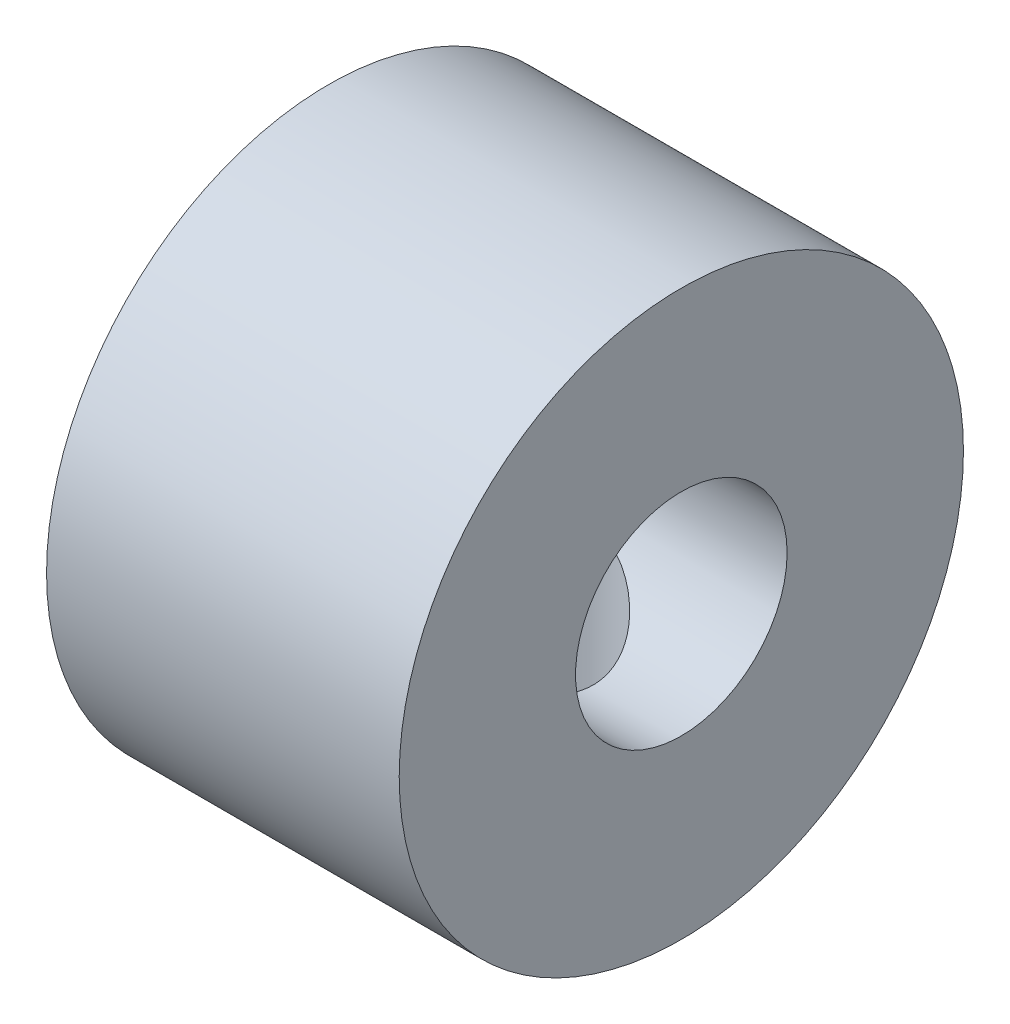
ISO-10303-21;
HEADER;
FILE_DESCRIPTION(('STEP AP214'),'2;1');
FILE_NAME('part.step','',(''),(''),'','','');
FILE_SCHEMA(('AUTOMOTIVE_DESIGN { 1 0 10303 214 1 1 1 1 }'));
ENDSEC;
DATA;
#1=APPLICATION_CONTEXT('core data for automotive mechanical design processes');
#2=APPLICATION_PROTOCOL_DEFINITION('international standard','automotive_design',2000,#1);
#3=PRODUCT_CONTEXT('',#1,'mechanical');
#4=PRODUCT('Part','Part','',(#3));
#5=PRODUCT_RELATED_PRODUCT_CATEGORY('part','',(#4));
#6=PRODUCT_DEFINITION_FORMATION('','',#4);
#7=PRODUCT_DEFINITION_CONTEXT('part definition',#1,'design');
#8=PRODUCT_DEFINITION('design','',#6,#7);
#9=PRODUCT_DEFINITION_SHAPE('','',#8);
#10=(LENGTH_UNIT() NAMED_UNIT(*) SI_UNIT(.MILLI.,.METRE.));
#11=(NAMED_UNIT(*) PLANE_ANGLE_UNIT() SI_UNIT($,.RADIAN.));
#12=(NAMED_UNIT(*) SI_UNIT($,.STERADIAN.) SOLID_ANGLE_UNIT());
#13=UNCERTAINTY_MEASURE_WITH_UNIT(LENGTH_MEASURE(1.E-05),#10,'distance_accuracy_value','');
#14=(GEOMETRIC_REPRESENTATION_CONTEXT(3) GLOBAL_UNCERTAINTY_ASSIGNED_CONTEXT((#13)) GLOBAL_UNIT_ASSIGNED_CONTEXT((#10,
#11,#12)) REPRESENTATION_CONTEXT('',''));
#15=CARTESIAN_POINT('',(0.,0.,0.));
#16=DIRECTION('',(0.,0.,1.));
#17=DIRECTION('',(1.,0.,0.));
#18=AXIS2_PLACEMENT_3D('',#15,#16,#17);
#19=CARTESIAN_POINT('',(5.,0.,0.));
#20=DIRECTION('',(1.,0.,0.));
#21=DIRECTION('',(0.,0.,-1.));
#22=AXIS2_PLACEMENT_3D('',#19,#20,#21);
#23=PLANE('',#22);
#24=CARTESIAN_POINT('',(5.,0.,0.));
#25=DIRECTION('',(1.,0.,0.));
#26=DIRECTION('',(0.,0.,-1.));
#27=AXIS2_PLACEMENT_3D('',#24,#25,#26);
#28=CIRCLE('',#27,4.);
#29=CARTESIAN_POINT('',(5.,0.,-4.));
#30=VERTEX_POINT('',#29);
#31=EDGE_CURVE('E10',#30,#30,#28,.T.);
#32=ORIENTED_EDGE('',*,*,#31,.T.);
#33=EDGE_LOOP('',(#32));
#34=FACE_BOUND('',#33,.T.);
#35=CARTESIAN_POINT('',(5.,0.,0.));
#36=DIRECTION('',(1.,0.,0.));
#37=DIRECTION('',(0.,0.,-1.));
#38=AXIS2_PLACEMENT_3D('',#35,#36,#37);
#39=CIRCLE('',#38,1.5);
#40=CARTESIAN_POINT('',(5.,0.,-1.5));
#41=VERTEX_POINT('',#40);
#42=EDGE_CURVE('E56',#41,#41,#39,.T.);
#43=ORIENTED_EDGE('',*,*,#42,.F.);
#44=EDGE_LOOP('',(#43));
#45=FACE_BOUND('',#44,.T.);
#46=ADVANCED_FACE('F37',(#34,#45),#23,.T.);
#47=CARTESIAN_POINT('',(0.,0.,0.));
#48=DIRECTION('',(1.,0.,0.));
#49=DIRECTION('',(0.,0.,-1.));
#50=AXIS2_PLACEMENT_3D('',#47,#48,#49);
#51=PLANE('',#50);
#52=CARTESIAN_POINT('',(0.,0.,0.));
#53=DIRECTION('',(1.,0.,0.));
#54=DIRECTION('',(0.,0.,-1.));
#55=AXIS2_PLACEMENT_3D('',#52,#53,#54);
#56=CIRCLE('',#55,4.);
#57=CARTESIAN_POINT('',(0.,0.,-4.));
#58=VERTEX_POINT('',#57);
#59=EDGE_CURVE('E51',#58,#58,#56,.T.);
#60=ORIENTED_EDGE('',*,*,#59,.F.);
#61=EDGE_LOOP('',(#60));
#62=FACE_BOUND('',#61,.T.);
#63=CARTESIAN_POINT('',(0.,0.,0.));
#64=DIRECTION('',(1.,0.,0.));
#65=DIRECTION('',(0.,0.,-1.));
#66=AXIS2_PLACEMENT_3D('',#63,#64,#65);
#67=CIRCLE('',#66,1.5);
#68=CARTESIAN_POINT('',(0.,0.,-1.5));
#69=VERTEX_POINT('',#68);
#70=EDGE_CURVE('E58',#69,#69,#67,.T.);
#71=ORIENTED_EDGE('',*,*,#70,.T.);
#72=EDGE_LOOP('',(#71));
#73=FACE_BOUND('',#72,.T.);
#74=ADVANCED_FACE('F79',(#62,#73),#51,.F.);
#75=CARTESIAN_POINT('',(5.,0.,0.));
#76=DIRECTION('',(-1.,0.,0.));
#77=DIRECTION('',(0.,0.,1.));
#78=AXIS2_PLACEMENT_3D('',#75,#76,#77);
#79=CYLINDRICAL_SURFACE('',#78,4.);
#80=CARTESIAN_POINT('',(1.25,-4.,0.));
#81=CARTESIAN_POINT('',(1.25000044658758,-3.99999965877989,0.0684391851745465));
#82=CARTESIAN_POINT('',(1.25563922694445,-3.99822694984841,0.136883052502859));
#83=CARTESIAN_POINT('',(1.27798624153924,-3.99132894088807,0.271769209588448));
#84=CARTESIAN_POINT('',(1.29469698136436,-3.9862028819986,0.338211042725907));
#85=CARTESIAN_POINT('',(1.33856937119574,-3.97315815697909,0.467128543650806));
#86=CARTESIAN_POINT('',(1.36571484465297,-3.96524381499025,0.529610176985804));
#87=CARTESIAN_POINT('',(1.42961731767833,-3.94743969161093,0.64913480234646));
#88=CARTESIAN_POINT('',(1.46637583178059,-3.93754959899905,0.706176935444885));
#89=CARTESIAN_POINT('',(1.54965599201736,-3.91650213740282,0.814965334952281));
#90=CARTESIAN_POINT('',(1.59642088506107,-3.90531715926989,0.86652002815666));
#91=CARTESIAN_POINT('',(1.69786839241355,-3.88310046374208,0.961197382036993));
#92=CARTESIAN_POINT('',(1.75255247749455,-3.87206877523457,1.0043184728987));
#93=CARTESIAN_POINT('',(1.86994456380808,-3.85111144698172,1.08194336483113));
#94=CARTESIAN_POINT('',(1.93281747752722,-3.84121988301796,1.11620784150129));
#95=CARTESIAN_POINT('',(2.06379231498187,-3.82407801799234,1.17359741076672));
#96=CARTESIAN_POINT('',(2.13189285579393,-3.81682702128689,1.19672543771945));
#97=CARTESIAN_POINT('',(2.26922807745206,-3.80607606984501,1.23048459930033));
#98=CARTESIAN_POINT('',(2.33836684363885,-3.80246972929508,1.24147110007865));
#99=CARTESIAN_POINT('',(2.47759311891189,-3.7991005514095,1.25174555036988));
#100=CARTESIAN_POINT('',(2.54768037082166,-3.79933669227334,1.25103660995772));
#101=CARTESIAN_POINT('',(2.68387446026898,-3.80353189075438,1.23821824732739));
#102=CARTESIAN_POINT('',(2.75002912586156,-3.80734341745949,1.22656057869383));
#103=CARTESIAN_POINT('',(2.87939215653735,-3.81802025652489,1.19290813355626));
#104=CARTESIAN_POINT('',(2.9426002077088,-3.82488589343115,1.1709122584455));
#105=CARTESIAN_POINT('',(3.06535194443263,-3.84101044014297,1.11688874681277));
#106=CARTESIAN_POINT('',(3.12482861069198,-3.85030284660824,1.08471925662082));
#107=CARTESIAN_POINT('',(3.23768776787912,-3.8702185658007,1.01136020737848));
#108=CARTESIAN_POINT('',(3.29106867025371,-3.88084222394551,0.970168305215772));
#109=CARTESIAN_POINT('',(3.39277494341699,-3.90281527800493,0.877716954182123));
#110=CARTESIAN_POINT('',(3.44075955777968,-3.91417569605696,0.826084570592817));
#111=CARTESIAN_POINT('',(3.52747189357968,-3.9359157075958,0.715364408095531));
#112=CARTESIAN_POINT('',(3.56619892921921,-3.94629522838372,0.656276077349021));
#113=CARTESIAN_POINT('',(3.63352768860127,-3.96501294890191,0.531664610465455));
#114=CARTESIAN_POINT('',(3.66204813546397,-3.97333460648208,0.46609490691928));
#115=CARTESIAN_POINT('',(3.70755300085157,-3.98687955828554,0.330767977782644));
#116=CARTESIAN_POINT('',(3.7245409222384,-3.99210379325151,0.261012030724609));
#117=CARTESIAN_POINT('',(3.74591804257898,-3.99871389395014,0.122185157290345));
#118=CARTESIAN_POINT('',(3.75076854359352,-4.00024022895439,0.0531918487888426));
#119=CARTESIAN_POINT('',(3.74903377336267,-3.99969799730981,-0.0846303057325845));
#120=CARTESIAN_POINT('',(3.7424501726774,-3.99762995581125,-0.153459174306505));
#121=CARTESIAN_POINT('',(3.71840440739361,-3.99022363769772,-0.287219332975852));
#122=CARTESIAN_POINT('',(3.70121673238748,-3.98496793110725,-0.352204978420948));
#123=CARTESIAN_POINT('',(3.65678564763331,-3.97180121379252,-0.478351928861365));
#124=CARTESIAN_POINT('',(3.62954099597509,-3.96388987514203,-0.539512760449016));
#125=CARTESIAN_POINT('',(3.56502678345121,-3.94598542759568,-0.657932406672231));
#126=CARTESIAN_POINT('',(3.52752901250278,-3.9359462681821,-0.715059739787955));
#127=CARTESIAN_POINT('',(3.44384678988298,-3.91493410002887,-0.822365850960095));
#128=CARTESIAN_POINT('',(3.39765998225689,-3.90396083845862,-0.872542738043336));
#129=CARTESIAN_POINT('',(3.29574110994631,-3.88176994885247,-0.966587462919656));
#130=CARTESIAN_POINT('',(3.23970333625474,-3.87055986714446,-1.01012652339774));
#131=CARTESIAN_POINT('',(3.12087338362926,-3.84961947087602,-1.08721250244909));
#132=CARTESIAN_POINT('',(3.05808131199557,-3.839889132814,-1.12075957972524));
#133=CARTESIAN_POINT('',(2.92765482711414,-3.82311782360754,-1.17670083481141));
#134=CARTESIAN_POINT('',(2.8600403504953,-3.81606646468027,-1.19913819558886));
#135=CARTESIAN_POINT('',(2.7217275066762,-3.80551170941212,-1.23222894320964));
#136=CARTESIAN_POINT('',(2.65103032362869,-3.80200696302675,-1.2428868141461));
#137=CARTESIAN_POINT('',(2.51199591244576,-3.79908292712494,-1.2517940615754));
#138=CARTESIAN_POINT('',(2.44369654618707,-3.79948604683077,-1.25058279621957));
#139=CARTESIAN_POINT('',(2.30832541508082,-3.80390090472383,-1.23708818129474));
#140=CARTESIAN_POINT('',(2.241253593116,-3.80791247457319,-1.22480534822559));
#141=CARTESIAN_POINT('',(2.11120596039822,-3.81896814158112,-1.18987729913378));
#142=CARTESIAN_POINT('',(2.04818455890399,-3.82596698183474,-1.16738642405944));
#143=CARTESIAN_POINT('',(1.92675958646865,-3.84219704261348,-1.11280227335064));
#144=CARTESIAN_POINT('',(1.86835695792232,-3.85142871716522,-1.08070704444254));
#145=CARTESIAN_POINT('',(1.75535402955944,-3.8715348703158,-1.00635675013475));
#146=CARTESIAN_POINT('',(1.70099187049956,-3.88245948922441,-0.963753335241274));
#147=CARTESIAN_POINT('',(1.6000136718882,-3.90448998821726,-0.870208996404849));
#148=CARTESIAN_POINT('',(1.553399711009,-3.91559591606795,-0.819265842344403));
#149=CARTESIAN_POINT('',(1.46771746163701,-3.93717271952329,-0.708486662823332));
#150=CARTESIAN_POINT('',(1.42894526355003,-3.94761101730634,-0.648414574487381));
#151=CARTESIAN_POINT('',(1.36210108486056,-3.96626769296916,-0.522279138013654));
#152=CARTESIAN_POINT('',(1.33402489785817,-3.97448694315832,-0.456218157795449));
#153=CARTESIAN_POINT('',(1.29140863239153,-3.98720650733461,-0.325747635373978));
#154=CARTESIAN_POINT('',(1.27592513269466,-3.99196240806139,-0.261670337112546));
#155=CARTESIAN_POINT('',(1.25522164003229,-3.99835900340486,-0.131729895440248));
#156=CARTESIAN_POINT('',(1.249999570196,-4.00000032839644,-0.0658671161396747));
#157=CARTESIAN_POINT('',(1.25,-4.,0.));
#158=B_SPLINE_CURVE_WITH_KNOTS('',3,(#80,#81,#82,#83,#84,#85,#86,#87,#88,#89,#90,#91,#92,#93,
#94,#95,#96,#97,#98,#99,#100,#101,#102,#103,#104,#105,#106,#107,#108,#109,#110,#111,#112,#113,
#114,#115,#116,#117,#118,#119,#120,#121,#122,#123,#124,#125,#126,#127,#128,#129,#130,#131,#132,
#133,#134,#135,#136,#137,#138,#139,#140,#141,#142,#143,#144,#145,#146,#147,#148,#149,#150,#151,
#152,#153,#154,#155,#156,#157),.UNSPECIFIED.,.T.,.F.,(4,2,2,2,2,2,2,2,2,2,2,2,2,2,2,2,2,2,2,2,2,
2,2,2,2,2,2,2,2,2,2,2,2,2,2,2,2,2,4),(0.,0.20507544943251,0.410197323349066,0.615002479202436,
0.819839921558391,1.03037822195158,1.24095567431276,1.45673771247494,1.67246286279527,
1.8816915016721,2.09086450295138,2.29176917422169,2.49269519979063,2.69655642720545,
2.90047066010358,3.113667472796,3.32688007413303,3.5417546068977,3.75656384494554,
3.96307568548237,4.16955735649363,4.37090626722872,4.572280050345,4.77856324738343,
4.98490245709259,5.1994177871314,5.41392970983712,5.62760115751031,5.84119123892431,
6.04512203476054,6.24904331751085,6.44997913396671,6.65095584330174,6.85979514006362,
7.06869037373341,7.28440668126412,7.50003806666337,7.69744636651541,7.89481470763048),.UNSPECIFIED.);
#159=CARTESIAN_POINT('',(1.25,-4.,0.));
#160=VERTEX_POINT('',#159);
#161=EDGE_CURVE('E61',#160,#160,#158,.T.);
#162=ORIENTED_EDGE('',*,*,#161,.T.);
#163=EDGE_LOOP('',(#162));
#164=FACE_BOUND('',#163,.T.);
#165=ORIENTED_EDGE('',*,*,#31,.F.);
#166=EDGE_LOOP('',(#165));
#167=FACE_BOUND('',#166,.T.);
#168=ORIENTED_EDGE('',*,*,#59,.T.);
#169=EDGE_LOOP('',(#168));
#170=FACE_BOUND('',#169,.T.);
#171=ADVANCED_FACE('F39',(#164,#167,#170),#79,.T.);
#172=CARTESIAN_POINT('',(5.,0.,0.));
#173=DIRECTION('',(-1.,0.,0.));
#174=DIRECTION('',(0.,0.,1.));
#175=AXIS2_PLACEMENT_3D('',#172,#173,#174);
#176=CYLINDRICAL_SURFACE('',#175,1.5);
#177=CARTESIAN_POINT('',(2.5,-0.82915619758885,1.25));
#178=CARTESIAN_POINT('',(2.5441647053802,-0.829171080733847,1.24999404087226));
#179=CARTESIAN_POINT('',(2.58838352122019,-0.832762375395265,1.24763049967423));
#180=CARTESIAN_POINT('',(2.67538530124638,-0.846396290427031,1.23841578381773));
#181=CARTESIAN_POINT('',(2.71816279845574,-0.856461077033122,1.23154918841669));
#182=CARTESIAN_POINT('',(2.81755543299884,-0.886166295980816,1.21043365494066));
#183=CARTESIAN_POINT('',(2.87310208001594,-0.908006666466335,1.19435434755409));
#184=CARTESIAN_POINT('',(2.97958263511899,-0.956683967866318,1.15573690008527));
#185=CARTESIAN_POINT('',(3.03050090455106,-0.983536965992068,1.13317786130272));
#186=CARTESIAN_POINT('',(3.14975837508035,-1.05182143936407,1.070817065168));
#187=CARTESIAN_POINT('',(3.21575985410453,-1.09442045045525,1.02781025867357));
#188=CARTESIAN_POINT('',(3.33891509928546,-1.17868626480119,0.929991014491964));
#189=CARTESIAN_POINT('',(3.39607705641117,-1.22035390008919,0.875189620049186));
#190=CARTESIAN_POINT('',(3.48929011660765,-1.29053257092503,0.76666365873756));
#191=CARTESIAN_POINT('',(3.52724727919612,-1.31995958434628,0.715176307152022));
#192=CARTESIAN_POINT('',(3.59567035779853,-1.37388140866488,0.605134546053412));
#193=CARTESIAN_POINT('',(3.62614840737724,-1.3983841964128,0.546591815897451));
#194=CARTESIAN_POINT('',(3.67355606310799,-1.43686412264528,0.43396568854128));
#195=CARTESIAN_POINT('',(3.69191688378329,-1.45192852122773,0.380860387543683));
#196=CARTESIAN_POINT('',(3.7214903033312,-1.47630204543212,0.27141697450591));
#197=CARTESIAN_POINT('',(3.73270702178971,-1.48561448777698,0.215080746020965));
#198=CARTESIAN_POINT('',(3.7473007228839,-1.49774576733632,0.100453129804022));
#199=CARTESIAN_POINT('',(3.75064491421972,-1.50053744334289,0.0421545865612124));
#200=CARTESIAN_POINT('',(3.74914887809637,-1.4992907190875,-0.0742637120693279));
#201=CARTESIAN_POINT('',(3.74430883194758,-1.49525247013301,-0.132383471389192));
#202=CARTESIAN_POINT('',(3.72739289605122,-1.48120670588946,-0.242722987690762));
#203=CARTESIAN_POINT('',(3.71582452214335,-1.47161807443047,-0.295076907899645));
#204=CARTESIAN_POINT('',(3.68652600330558,-1.44750645993,-0.396813223309236));
#205=CARTESIAN_POINT('',(3.66879497446605,-1.43298276905958,-0.446195191050166));
#206=CARTESIAN_POINT('',(3.62620474375288,-1.39845194139805,-0.545266441516649));
#207=CARTESIAN_POINT('',(3.60086539417456,-1.3780819168441,-0.594620394489257));
#208=CARTESIAN_POINT('',(3.54480037361997,-1.33372220395884,-0.688391071359199));
#209=CARTESIAN_POINT('',(3.5140698614123,-1.30972926499254,-0.732803298534893));
#210=CARTESIAN_POINT('',(3.43227740848526,-1.24725283392922,-0.83639372253195));
#211=CARTESIAN_POINT('',(3.3784966096062,-1.20730441725272,-0.892549793915361));
#212=CARTESIAN_POINT('',(3.26232443114911,-1.1255679714589,-0.993638529177489));
#213=CARTESIAN_POINT('',(3.1999180103951,-1.08377681764698,-1.03855119382815));
#214=CARTESIAN_POINT('',(3.08441929350592,-1.01367839645618,-1.10642031272616));
#215=CARTESIAN_POINT('',(3.03326254482451,-0.984740465846713,-1.13203948271785));
#216=CARTESIAN_POINT('',(2.9260750534637,-0.931069709507045,-1.17656863192196));
#217=CARTESIAN_POINT('',(2.87005871514294,-0.906325057687519,-1.19549764866108));
#218=CARTESIAN_POINT('',(2.77208893578056,-0.871882971831377,-1.2207056855963));
#219=CARTESIAN_POINT('',(2.73150038212869,-0.859909724231176,-1.22909685175358));
#220=CARTESIAN_POINT('',(2.6485196693188,-0.841388366026596,-1.24185130532595));
#221=CARTESIAN_POINT('',(2.60613199902475,-0.834827501853268,-1.24622406437787));
#222=CARTESIAN_POINT('',(2.52028601228656,-0.828296528501301,-1.25057759306024));
#223=CARTESIAN_POINT('',(2.47682219866485,-0.828374008685671,-1.25052664975154));
#224=CARTESIAN_POINT('',(2.39064745065353,-0.835225782947457,-1.24595802348496));
#225=CARTESIAN_POINT('',(2.34793764208718,-0.842009349756118,-1.2414341556627));
#226=CARTESIAN_POINT('',(2.25390646428801,-0.863399128259967,-1.22668003680201));
#227=CARTESIAN_POINT('',(2.20313208960554,-0.879547518492397,-1.21529777259545));
#228=CARTESIAN_POINT('',(2.10518922100382,-0.917232747019936,-1.18711365735935));
#229=CARTESIAN_POINT('',(2.05803328994198,-0.938787339391922,-1.17029389583343));
#230=CARTESIAN_POINT('',(1.94138936969155,-0.997868621064607,-1.12091579801676));
#231=CARTESIAN_POINT('',(1.87446452954936,-1.03750412177145,-1.08484810385271));
#232=CARTESIAN_POINT('',(1.74857371632911,-1.11795958286266,-1.00177028688711));
#233=CARTESIAN_POINT('',(1.68961947085346,-1.15878118348296,-0.954744311539849));
#234=CARTESIAN_POINT('',(1.57876053958777,-1.23882330951385,-0.848446129663134));
#235=CARTESIAN_POINT('',(1.52707322352613,-1.27797673016273,-0.788892937369297));
#236=CARTESIAN_POINT('',(1.43457074879173,-1.34974000513072,-0.658554811895193));
#237=CARTESIAN_POINT('',(1.39371920684041,-1.38237166417955,-0.587808772156702));
#238=CARTESIAN_POINT('',(1.33702826429526,-1.42822592109972,-0.461595088972366));
#239=CARTESIAN_POINT('',(1.3173880886566,-1.44429507033464,-0.40885943902426));
#240=CARTESIAN_POINT('',(1.28518537245677,-1.47077851557488,-0.299904276444415));
#241=CARTESIAN_POINT('',(1.27261732263686,-1.4811972131105,-0.24368751364012));
#242=CARTESIAN_POINT('',(1.25531047922875,-1.49556964902824,-0.128950522663661));
#243=CARTESIAN_POINT('',(1.25060938411023,-1.4994922572063,-0.0704205711750213));
#244=CARTESIAN_POINT('',(1.24950244256502,-1.50041455454009,0.0467748285323646));
#245=CARTESIAN_POINT('',(1.25309599032294,-1.49741474928776,0.105440266542954));
#246=CARTESIAN_POINT('',(1.26774744138822,-1.48523794227419,0.216739569352152));
#247=CARTESIAN_POINT('',(1.27824292393868,-1.47652651443397,0.269501624532625));
#248=CARTESIAN_POINT('',(1.30552202058619,-1.454035179736,0.372221179705345));
#249=CARTESIAN_POINT('',(1.32230661802057,-1.44025448027619,0.42217823971607));
#250=CARTESIAN_POINT('',(1.36280826049913,-1.40732209423502,0.521919916074484));
#251=CARTESIAN_POINT('',(1.38693968014984,-1.38785344874152,0.57142944973236));
#252=CARTESIAN_POINT('',(1.44060367327501,-1.34519757223152,0.665676902134276));
#253=CARTESIAN_POINT('',(1.47014041110857,-1.32200747584648,0.71041109950456));
#254=CARTESIAN_POINT('',(1.54901521279332,-1.26133215586173,0.81500495879082));
#255=CARTESIAN_POINT('',(1.6010828180055,-1.22230011385721,0.87191685643911));
#256=CARTESIAN_POINT('',(1.71376516184283,-1.14196239842367,0.974772820153254));
#257=CARTESIAN_POINT('',(1.7743977346542,-1.10065209341852,1.02069344825836));
#258=CARTESIAN_POINT('',(1.88976833872727,-1.02874460749124,1.09255581437418));
#259=CARTESIAN_POINT('',(1.94292741295027,-0.997768980763184,1.12067062123728));
#260=CARTESIAN_POINT('',(2.05462162074648,-0.939989503311799,1.16954598910695));
#261=CARTESIAN_POINT('',(2.11314155416062,-0.913174404589166,1.1903265794276));
#262=CARTESIAN_POINT('',(2.21493875653809,-0.87598470926776,1.21778307121979));
#263=CARTESIAN_POINT('',(2.25663962394329,-0.863119730558271,1.22685233579967));
#264=CARTESIAN_POINT('',(2.3420112171475,-0.843069286999135,1.24072116574167));
#265=CARTESIAN_POINT('',(2.38567367610932,-0.835861989029706,1.24553715368945));
#266=CARTESIAN_POINT('',(2.45307006590597,-0.830150605780696,1.2493403884987));
#267=CARTESIAN_POINT('',(2.47652739066685,-0.829148287511218,1.2500031671507));
#268=CARTESIAN_POINT('',(2.5,-0.82915619758885,1.25));
#269=B_SPLINE_CURVE_WITH_KNOTS('',3,(#177,#178,#179,#180,#181,#182,#183,#184,#185,#186,#187,
#188,#189,#190,#191,#192,#193,#194,#195,#196,#197,#198,#199,#200,#201,#202,#203,#204,#205,#206,
#207,#208,#209,#210,#211,#212,#213,#214,#215,#216,#217,#218,#219,#220,#221,#222,#223,#224,#225,
#226,#227,#228,#229,#230,#231,#232,#233,#234,#235,#236,#237,#238,#239,#240,#241,#242,#243,#244,
#245,#246,#247,#248,#249,#250,#251,#252,#253,#254,#255,#256,#257,#258,#259,#260,#261,#262,#263,
#264,#265,#266,#267,#268),.UNSPECIFIED.,.T.,.F.,(4,2,2,2,2,2,2,2,2,2,2,2,2,2,2,2,2,2,2,2,2,2,2,
2,2,2,2,2,2,2,2,2,2,2,2,2,2,2,2,2,2,2,2,2,2,4),(0.,0.132403743422232,0.265263288930073,
0.449655855557673,0.634649942144407,0.902012441026489,1.16912568969086,1.37958069530741,
1.58969198279197,1.76348814983066,1.93718400783419,2.11160208780425,2.2860163038354,
2.44872292747117,2.61145289775614,2.78810848727759,2.96492353213236,3.22582525437774,
3.48718781023124,3.67905555270854,3.87037283441413,3.9993530692101,4.12802850386463,
4.25762647137534,4.38740388935218,4.54993403686821,4.71300509008802,4.96887834533348,
5.22512407721335,5.48788549042255,5.74975312897907,5.9246269566114,6.09936436646697,
6.27493674560801,6.45049630188436,6.61327577206191,6.77608070432303,6.95068885647624,
7.1254321007351,7.38342809840436,7.64196944496193,7.84437004385549,8.04621354192261,
8.17947958193174,8.31222878184587,8.38259857865177),.UNSPECIFIED.);
#270=CARTESIAN_POINT('',(2.5,-0.82915619758885,1.25));
#271=VERTEX_POINT('',#270);
#272=EDGE_CURVE('E42',#271,#271,#269,.T.);
#273=ORIENTED_EDGE('',*,*,#272,.F.);
#274=EDGE_LOOP('',(#273));
#275=FACE_BOUND('',#274,.T.);
#276=ORIENTED_EDGE('',*,*,#42,.T.);
#277=EDGE_LOOP('',(#276));
#278=FACE_BOUND('',#277,.T.);
#279=ORIENTED_EDGE('',*,*,#70,.F.);
#280=EDGE_LOOP('',(#279));
#281=FACE_BOUND('',#280,.T.);
#282=ADVANCED_FACE('F71',(#275,#278,#281),#176,.F.);
#283=CARTESIAN_POINT('',(2.5,-4.,0.));
#284=DIRECTION('',(0.,1.,0.));
#285=DIRECTION('',(0.,0.,1.));
#286=AXIS2_PLACEMENT_3D('',#283,#284,#285);
#287=CYLINDRICAL_SURFACE('',#286,1.25);
#288=ORIENTED_EDGE('',*,*,#272,.T.);
#289=EDGE_LOOP('',(#288));
#290=FACE_BOUND('',#289,.T.);
#291=ORIENTED_EDGE('',*,*,#161,.F.);
#292=EDGE_LOOP('',(#291));
#293=FACE_BOUND('',#292,.T.);
#294=ADVANCED_FACE('F68',(#290,#293),#287,.F.);
#295=CLOSED_SHELL('',(#46,#74,#171,#282,#294));
#296=MANIFOLD_SOLID_BREP('B2',#295);
#297=ADVANCED_BREP_SHAPE_REPRESENTATION('',(#18,#296),#14);
#298=SHAPE_DEFINITION_REPRESENTATION(#9,#297);
ENDSEC;
END-ISO-10303-21;
